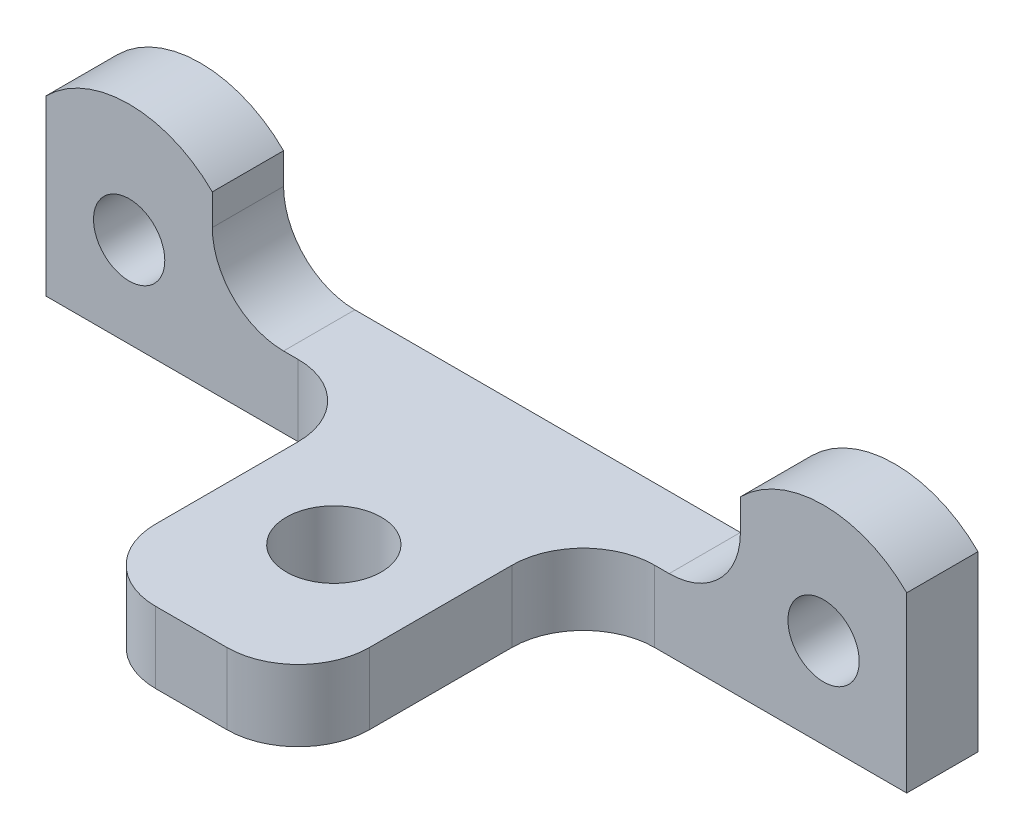
ISO-10303-21;
HEADER;
FILE_DESCRIPTION(('STEP AP214'),'2;1');
FILE_NAME('part.step','',(''),(''),'','','');
FILE_SCHEMA(('AUTOMOTIVE_DESIGN { 1 0 10303 214 1 1 1 1 }'));
ENDSEC;
DATA;
#1=APPLICATION_CONTEXT('core data for automotive mechanical design processes');
#2=APPLICATION_PROTOCOL_DEFINITION('international standard','automotive_design',2000,#1);
#3=PRODUCT_CONTEXT('',#1,'mechanical');
#4=PRODUCT('Part','Part','',(#3));
#5=PRODUCT_RELATED_PRODUCT_CATEGORY('part','',(#4));
#6=PRODUCT_DEFINITION_FORMATION('','',#4);
#7=PRODUCT_DEFINITION_CONTEXT('part definition',#1,'design');
#8=PRODUCT_DEFINITION('design','',#6,#7);
#9=PRODUCT_DEFINITION_SHAPE('','',#8);
#10=(LENGTH_UNIT() NAMED_UNIT(*) SI_UNIT(.MILLI.,.METRE.));
#11=(NAMED_UNIT(*) PLANE_ANGLE_UNIT() SI_UNIT($,.RADIAN.));
#12=(NAMED_UNIT(*) SI_UNIT($,.STERADIAN.) SOLID_ANGLE_UNIT());
#13=UNCERTAINTY_MEASURE_WITH_UNIT(LENGTH_MEASURE(1.E-05),#10,'distance_accuracy_value','');
#14=(GEOMETRIC_REPRESENTATION_CONTEXT(3) GLOBAL_UNCERTAINTY_ASSIGNED_CONTEXT((#13)) GLOBAL_UNIT_ASSIGNED_CONTEXT((#10,
#11,#12)) REPRESENTATION_CONTEXT('',''));
#15=CARTESIAN_POINT('',(0.,0.,0.));
#16=DIRECTION('',(0.,0.,1.));
#17=DIRECTION('',(1.,0.,0.));
#18=AXIS2_PLACEMENT_3D('',#15,#16,#17);
#19=CARTESIAN_POINT('',(-14.615,3.8,3.));
#20=DIRECTION('',(0.,0.,-1.));
#21=DIRECTION('',(-1.,0.,0.));
#22=AXIS2_PLACEMENT_3D('',#19,#20,#21);
#23=PLANE('',#22);
#24=CARTESIAN_POINT('',(-14.615,3.8,3.));
#25=DIRECTION('',(0.,0.,1.));
#26=DIRECTION('',(1.,0.,0.));
#27=AXIS2_PLACEMENT_3D('',#24,#25,#26);
#28=CIRCLE('',#27,1.5);
#29=CARTESIAN_POINT('',(-13.115,3.8,3.));
#30=VERTEX_POINT('',#29);
#31=EDGE_CURVE('E274',#30,#30,#28,.T.);
#32=ORIENTED_EDGE('',*,*,#31,.F.);
#33=EDGE_LOOP('',(#32));
#34=FACE_BOUND('',#33,.T.);
#35=DIRECTION('',(1.,0.,0.));
#36=VECTOR('',#35,1.);
#37=CARTESIAN_POINT('',(-18.115,0.,3.));
#38=LINE('',#37,#36);
#39=CARTESIAN_POINT('',(-18.115,0.,3.));
#40=VERTEX_POINT('',#39);
#41=CARTESIAN_POINT('',(-7.5,0.,3.));
#42=VERTEX_POINT('',#41);
#43=EDGE_CURVE('E317',#40,#42,#38,.T.);
#44=ORIENTED_EDGE('',*,*,#43,.T.);
#45=DIRECTION('',(0.,-1.,0.));
#46=VECTOR('',#45,1.);
#47=CARTESIAN_POINT('',(-7.5,3.,3.));
#48=LINE('',#47,#46);
#49=CARTESIAN_POINT('',(-7.5,3.,3.));
#50=VERTEX_POINT('',#49);
#51=EDGE_CURVE('E220',#42,#50,#48,.F.);
#52=ORIENTED_EDGE('',*,*,#51,.T.);
#53=DIRECTION('',(-1.,0.,0.));
#54=VECTOR('',#53,1.);
#55=CARTESIAN_POINT('',(-11.115,3.,3.));
#56=LINE('',#55,#54);
#57=CARTESIAN_POINT('',(-8.115,3.,3.));
#58=VERTEX_POINT('',#57);
#59=EDGE_CURVE('E263',#50,#58,#56,.T.);
#60=ORIENTED_EDGE('',*,*,#59,.T.);
#61=CARTESIAN_POINT('',(-8.115,6.,3.));
#62=DIRECTION('',(0.,0.,-1.));
#63=DIRECTION('',(-1.,0.,0.));
#64=AXIS2_PLACEMENT_3D('',#61,#62,#63);
#65=CIRCLE('',#64,3.);
#66=CARTESIAN_POINT('',(-11.115,6.,3.));
#67=VERTEX_POINT('',#66);
#68=EDGE_CURVE('E228',#58,#67,#65,.T.);
#69=ORIENTED_EDGE('',*,*,#68,.T.);
#70=DIRECTION('',(0.,1.,0.));
#71=VECTOR('',#70,1.);
#72=CARTESIAN_POINT('',(-11.115,7.3,3.));
#73=LINE('',#72,#71);
#74=CARTESIAN_POINT('',(-11.115,7.3,3.));
#75=VERTEX_POINT('',#74);
#76=EDGE_CURVE('E171',#67,#75,#73,.T.);
#77=ORIENTED_EDGE('',*,*,#76,.T.);
#78=CARTESIAN_POINT('',(-14.615,3.8,3.));
#79=DIRECTION('',(0.,0.,1.));
#80=DIRECTION('',(-1.,0.,0.));
#81=AXIS2_PLACEMENT_3D('',#78,#79,#80);
#82=CIRCLE('',#81,4.94974746830583);
#83=CARTESIAN_POINT('',(-18.115,7.3,3.));
#84=VERTEX_POINT('',#83);
#85=EDGE_CURVE('E167',#75,#84,#82,.T.);
#86=ORIENTED_EDGE('',*,*,#85,.T.);
#87=DIRECTION('',(0.,-1.,0.));
#88=VECTOR('',#87,1.);
#89=CARTESIAN_POINT('',(-18.115,7.3,3.));
#90=LINE('',#89,#88);
#91=EDGE_CURVE('E157',#84,#40,#90,.T.);
#92=ORIENTED_EDGE('',*,*,#91,.T.);
#93=EDGE_LOOP('',(#44,#52,#60,#69,#77,#86,#92));
#94=FACE_BOUND('',#93,.T.);
#95=ADVANCED_FACE('F33',(#34,#94),#23,.F.);
#96=CARTESIAN_POINT('',(14.615,3.80000000000001,3.));
#97=DIRECTION('',(0.,0.,1.));
#98=DIRECTION('',(1.,0.,0.));
#99=AXIS2_PLACEMENT_3D('',#96,#97,#98);
#100=CIRCLE('',#99,1.5);
#101=CARTESIAN_POINT('',(16.115,3.80000000000001,3.));
#102=VERTEX_POINT('',#101);
#103=EDGE_CURVE('E324',#102,#102,#100,.T.);
#104=ORIENTED_EDGE('',*,*,#103,.F.);
#105=EDGE_LOOP('',(#104));
#106=FACE_BOUND('',#105,.T.);
#107=CARTESIAN_POINT('',(8.115,3.,3.));
#108=VERTEX_POINT('',#107);
#109=CARTESIAN_POINT('',(7.5,3.,3.));
#110=VERTEX_POINT('',#109);
#111=EDGE_CURVE('E257',#108,#110,#56,.T.);
#112=ORIENTED_EDGE('',*,*,#111,.T.);
#113=DIRECTION('',(0.,1.,0.));
#114=VECTOR('',#113,1.);
#115=CARTESIAN_POINT('',(7.5,0.,3.));
#116=LINE('',#115,#114);
#117=CARTESIAN_POINT('',(7.5,0.,3.));
#118=VERTEX_POINT('',#117);
#119=EDGE_CURVE('E204',#110,#118,#116,.F.);
#120=ORIENTED_EDGE('',*,*,#119,.T.);
#121=CARTESIAN_POINT('',(18.115,0.,3.));
#122=VERTEX_POINT('',#121);
#123=EDGE_CURVE('E166',#118,#122,#38,.T.);
#124=ORIENTED_EDGE('',*,*,#123,.T.);
#125=DIRECTION('',(0.,1.,0.));
#126=VECTOR('',#125,1.);
#127=CARTESIAN_POINT('',(18.115,0.,3.));
#128=LINE('',#127,#126);
#129=CARTESIAN_POINT('',(18.115,7.30000000000001,3.));
#130=VERTEX_POINT('',#129);
#131=EDGE_CURVE('E301',#122,#130,#128,.T.);
#132=ORIENTED_EDGE('',*,*,#131,.T.);
#133=CARTESIAN_POINT('',(14.615,3.80000000000001,3.));
#134=DIRECTION('',(0.,0.,1.));
#135=DIRECTION('',(-1.,0.,0.));
#136=AXIS2_PLACEMENT_3D('',#133,#134,#135);
#137=CIRCLE('',#136,4.94974746830583);
#138=CARTESIAN_POINT('',(11.115,7.3,3.));
#139=VERTEX_POINT('',#138);
#140=EDGE_CURVE('E316',#130,#139,#137,.T.);
#141=ORIENTED_EDGE('',*,*,#140,.T.);
#142=DIRECTION('',(0.,-1.,0.));
#143=VECTOR('',#142,1.);
#144=CARTESIAN_POINT('',(11.115,3.,3.));
#145=LINE('',#144,#143);
#146=CARTESIAN_POINT('',(11.115,6.,3.));
#147=VERTEX_POINT('',#146);
#148=EDGE_CURVE('E268',#139,#147,#145,.T.);
#149=ORIENTED_EDGE('',*,*,#148,.T.);
#150=CARTESIAN_POINT('',(8.115,6.,3.));
#151=DIRECTION('',(0.,0.,-1.));
#152=DIRECTION('',(-1.,0.,0.));
#153=AXIS2_PLACEMENT_3D('',#150,#151,#152);
#154=CIRCLE('',#153,3.);
#155=EDGE_CURVE('E224',#147,#108,#154,.T.);
#156=ORIENTED_EDGE('',*,*,#155,.T.);
#157=EDGE_LOOP('',(#112,#120,#124,#132,#141,#149,#156));
#158=FACE_BOUND('',#157,.T.);
#159=ADVANCED_FACE('F260',(#106,#158),#23,.F.);
#160=CARTESIAN_POINT('',(-14.615,3.8,0.));
#161=DIRECTION('',(0.,0.,-1.));
#162=DIRECTION('',(-1.,0.,0.));
#163=AXIS2_PLACEMENT_3D('',#160,#161,#162);
#164=PLANE('',#163);
#165=CARTESIAN_POINT('',(-14.615,3.8,0.));
#166=DIRECTION('',(0.,0.,1.));
#167=DIRECTION('',(1.,0.,0.));
#168=AXIS2_PLACEMENT_3D('',#165,#166,#167);
#169=CIRCLE('',#168,1.5);
#170=CARTESIAN_POINT('',(-13.115,3.8,0.));
#171=VERTEX_POINT('',#170);
#172=EDGE_CURVE('E321',#171,#171,#169,.T.);
#173=ORIENTED_EDGE('',*,*,#172,.T.);
#174=EDGE_LOOP('',(#173));
#175=FACE_BOUND('',#174,.T.);
#176=CARTESIAN_POINT('',(-14.615,3.8,0.));
#177=DIRECTION('',(0.,0.,1.));
#178=DIRECTION('',(-1.,0.,0.));
#179=AXIS2_PLACEMENT_3D('',#176,#177,#178);
#180=CIRCLE('',#179,4.94974746830583);
#181=CARTESIAN_POINT('',(-11.115,7.3,0.));
#182=VERTEX_POINT('',#181);
#183=CARTESIAN_POINT('',(-18.115,7.3,0.));
#184=VERTEX_POINT('',#183);
#185=EDGE_CURVE('E179',#182,#184,#180,.T.);
#186=ORIENTED_EDGE('',*,*,#185,.F.);
#187=DIRECTION('',(0.,1.,0.));
#188=VECTOR('',#187,1.);
#189=CARTESIAN_POINT('',(-11.115,7.3,0.));
#190=LINE('',#189,#188);
#191=CARTESIAN_POINT('',(-11.115,6.,0.));
#192=VERTEX_POINT('',#191);
#193=EDGE_CURVE('E175',#192,#182,#190,.T.);
#194=ORIENTED_EDGE('',*,*,#193,.F.);
#195=CARTESIAN_POINT('',(-8.115,6.,0.));
#196=DIRECTION('',(0.,0.,-1.));
#197=DIRECTION('',(-1.,0.,0.));
#198=AXIS2_PLACEMENT_3D('',#195,#196,#197);
#199=CIRCLE('',#198,3.);
#200=CARTESIAN_POINT('',(-8.115,3.,0.));
#201=VERTEX_POINT('',#200);
#202=EDGE_CURVE('E226',#192,#201,#199,.F.);
#203=ORIENTED_EDGE('',*,*,#202,.T.);
#204=DIRECTION('',(-1.,0.,0.));
#205=VECTOR('',#204,1.);
#206=CARTESIAN_POINT('',(-11.115,3.,0.));
#207=LINE('',#206,#205);
#208=CARTESIAN_POINT('',(8.115,3.,0.));
#209=VERTEX_POINT('',#208);
#210=EDGE_CURVE('E285',#209,#201,#207,.T.);
#211=ORIENTED_EDGE('',*,*,#210,.F.);
#212=CARTESIAN_POINT('',(8.115,6.,0.));
#213=DIRECTION('',(0.,0.,-1.));
#214=DIRECTION('',(-1.,0.,0.));
#215=AXIS2_PLACEMENT_3D('',#212,#213,#214);
#216=CIRCLE('',#215,3.);
#217=CARTESIAN_POINT('',(11.115,6.,0.));
#218=VERTEX_POINT('',#217);
#219=EDGE_CURVE('E222',#209,#218,#216,.F.);
#220=ORIENTED_EDGE('',*,*,#219,.T.);
#221=DIRECTION('',(0.,-1.,0.));
#222=VECTOR('',#221,1.);
#223=CARTESIAN_POINT('',(11.115,3.,0.));
#224=LINE('',#223,#222);
#225=CARTESIAN_POINT('',(11.115,7.3,0.));
#226=VERTEX_POINT('',#225);
#227=EDGE_CURVE('E282',#226,#218,#224,.T.);
#228=ORIENTED_EDGE('',*,*,#227,.F.);
#229=CARTESIAN_POINT('',(14.615,3.80000000000001,0.));
#230=DIRECTION('',(0.,0.,1.));
#231=DIRECTION('',(-1.,0.,0.));
#232=AXIS2_PLACEMENT_3D('',#229,#230,#231);
#233=CIRCLE('',#232,4.94974746830583);
#234=CARTESIAN_POINT('',(18.115,7.30000000000001,0.));
#235=VERTEX_POINT('',#234);
#236=EDGE_CURVE('E280',#235,#226,#233,.T.);
#237=ORIENTED_EDGE('',*,*,#236,.F.);
#238=DIRECTION('',(0.,1.,0.));
#239=VECTOR('',#238,1.);
#240=CARTESIAN_POINT('',(18.115,0.,0.));
#241=LINE('',#240,#239);
#242=CARTESIAN_POINT('',(18.115,0.,0.));
#243=VERTEX_POINT('',#242);
#244=EDGE_CURVE('E278',#243,#235,#241,.T.);
#245=ORIENTED_EDGE('',*,*,#244,.F.);
#246=DIRECTION('',(1.,0.,0.));
#247=VECTOR('',#246,1.);
#248=CARTESIAN_POINT('',(-18.115,0.,0.));
#249=LINE('',#248,#247);
#250=CARTESIAN_POINT('',(-18.115,0.,0.));
#251=VERTEX_POINT('',#250);
#252=EDGE_CURVE('E276',#251,#243,#249,.T.);
#253=ORIENTED_EDGE('',*,*,#252,.F.);
#254=DIRECTION('',(0.,-1.,0.));
#255=VECTOR('',#254,1.);
#256=CARTESIAN_POINT('',(-18.115,7.3,0.));
#257=LINE('',#256,#255);
#258=EDGE_CURVE('E273',#184,#251,#257,.T.);
#259=ORIENTED_EDGE('',*,*,#258,.F.);
#260=EDGE_LOOP('',(#186,#194,#203,#211,#220,#228,#237,#245,#253,#259));
#261=FACE_BOUND('',#260,.T.);
#262=CARTESIAN_POINT('',(14.615,3.80000000000001,0.));
#263=DIRECTION('',(0.,0.,1.));
#264=DIRECTION('',(1.,0.,0.));
#265=AXIS2_PLACEMENT_3D('',#262,#263,#264);
#266=CIRCLE('',#265,1.5);
#267=CARTESIAN_POINT('',(16.115,3.80000000000001,0.));
#268=VERTEX_POINT('',#267);
#269=EDGE_CURVE('E327',#268,#268,#266,.T.);
#270=ORIENTED_EDGE('',*,*,#269,.T.);
#271=EDGE_LOOP('',(#270));
#272=FACE_BOUND('',#271,.T.);
#273=ADVANCED_FACE('F305',(#175,#261,#272),#164,.T.);
#274=CARTESIAN_POINT('',(-14.615,3.8,3.));
#275=DIRECTION('',(0.,0.,-1.));
#276=DIRECTION('',(-1.,0.,0.));
#277=AXIS2_PLACEMENT_3D('',#274,#275,#276);
#278=CYLINDRICAL_SURFACE('',#277,4.94974746830583);
#279=ORIENTED_EDGE('',*,*,#185,.T.);
#280=DIRECTION('',(0.,0.,-1.));
#281=VECTOR('',#280,1.);
#282=CARTESIAN_POINT('',(-18.115,7.3,3.));
#283=LINE('',#282,#281);
#284=EDGE_CURVE('E161',#84,#184,#283,.T.);
#285=ORIENTED_EDGE('',*,*,#284,.F.);
#286=ORIENTED_EDGE('',*,*,#85,.F.);
#287=DIRECTION('',(0.,0.,-1.));
#288=VECTOR('',#287,1.);
#289=CARTESIAN_POINT('',(-11.115,7.3,3.));
#290=LINE('',#289,#288);
#291=EDGE_CURVE('E265',#75,#182,#290,.T.);
#292=ORIENTED_EDGE('',*,*,#291,.T.);
#293=EDGE_LOOP('',(#279,#285,#286,#292));
#294=FACE_BOUND('',#293,.T.);
#295=ADVANCED_FACE('F177',(#294),#278,.T.);
#296=CARTESIAN_POINT('',(-18.115,7.3,3.));
#297=DIRECTION('',(1.,0.,0.));
#298=DIRECTION('',(0.,0.,-1.));
#299=AXIS2_PLACEMENT_3D('',#296,#297,#298);
#300=PLANE('',#299);
#301=ORIENTED_EDGE('',*,*,#258,.T.);
#302=DIRECTION('',(0.,0.,-1.));
#303=VECTOR('',#302,1.);
#304=CARTESIAN_POINT('',(-18.115,0.,3.));
#305=LINE('',#304,#303);
#306=EDGE_CURVE('E164',#40,#251,#305,.T.);
#307=ORIENTED_EDGE('',*,*,#306,.F.);
#308=ORIENTED_EDGE('',*,*,#91,.F.);
#309=ORIENTED_EDGE('',*,*,#284,.T.);
#310=EDGE_LOOP('',(#301,#307,#308,#309));
#311=FACE_BOUND('',#310,.T.);
#312=ADVANCED_FACE('F159',(#311),#300,.F.);
#313=CARTESIAN_POINT('',(-18.115,0.,3.));
#314=DIRECTION('',(0.,1.,0.));
#315=DIRECTION('',(0.,0.,1.));
#316=AXIS2_PLACEMENT_3D('',#313,#314,#315);
#317=PLANE('',#316);
#318=CARTESIAN_POINT('',(0.,0.,9.));
#319=DIRECTION('',(0.,1.,0.));
#320=DIRECTION('',(0.,0.,1.));
#321=AXIS2_PLACEMENT_3D('',#318,#319,#320);
#322=CIRCLE('',#321,2.);
#323=CARTESIAN_POINT('',(0.,0.,11.));
#324=VERTEX_POINT('',#323);
#325=EDGE_CURVE('E343',#324,#324,#322,.T.);
#326=ORIENTED_EDGE('',*,*,#325,.T.);
#327=EDGE_LOOP('',(#326));
#328=FACE_BOUND('',#327,.T.);
#329=DIRECTION('',(0.,0.,-1.));
#330=VECTOR('',#329,1.);
#331=CARTESIAN_POINT('',(4.5,0.,15.));
#332=LINE('',#331,#330);
#333=CARTESIAN_POINT('',(4.5,0.,12.));
#334=VERTEX_POINT('',#333);
#335=CARTESIAN_POINT('',(4.5,0.,6.));
#336=VERTEX_POINT('',#335);
#337=EDGE_CURVE('E238',#334,#336,#332,.T.);
#338=ORIENTED_EDGE('',*,*,#337,.F.);
#339=CARTESIAN_POINT('',(1.5,0.,12.));
#340=DIRECTION('',(0.,1.,0.));
#341=DIRECTION('',(0.,0.,1.));
#342=AXIS2_PLACEMENT_3D('',#339,#340,#341);
#343=CIRCLE('',#342,3.);
#344=CARTESIAN_POINT('',(1.5,0.,15.));
#345=VERTEX_POINT('',#344);
#346=EDGE_CURVE('E214',#334,#345,#343,.F.);
#347=ORIENTED_EDGE('',*,*,#346,.T.);
#348=DIRECTION('',(1.,0.,0.));
#349=VECTOR('',#348,1.);
#350=CARTESIAN_POINT('',(-4.5,0.,15.));
#351=LINE('',#350,#349);
#352=CARTESIAN_POINT('',(-1.5,0.,15.));
#353=VERTEX_POINT('',#352);
#354=EDGE_CURVE('E340',#353,#345,#351,.T.);
#355=ORIENTED_EDGE('',*,*,#354,.F.);
#356=CARTESIAN_POINT('',(-1.5,0.,12.));
#357=DIRECTION('',(0.,1.,0.));
#358=DIRECTION('',(0.,0.,1.));
#359=AXIS2_PLACEMENT_3D('',#356,#357,#358);
#360=CIRCLE('',#359,3.);
#361=CARTESIAN_POINT('',(-4.5,0.,12.));
#362=VERTEX_POINT('',#361);
#363=EDGE_CURVE('E212',#353,#362,#360,.F.);
#364=ORIENTED_EDGE('',*,*,#363,.T.);
#365=DIRECTION('',(0.,0.,-1.));
#366=VECTOR('',#365,1.);
#367=CARTESIAN_POINT('',(-4.5,0.,15.));
#368=LINE('',#367,#366);
#369=CARTESIAN_POINT('',(-4.5,0.,6.));
#370=VERTEX_POINT('',#369);
#371=EDGE_CURVE('E249',#362,#370,#368,.T.);
#372=ORIENTED_EDGE('',*,*,#371,.T.);
#373=CARTESIAN_POINT('',(-7.5,0.,6.));
#374=DIRECTION('',(0.,1.,0.));
#375=DIRECTION('',(0.,0.,1.));
#376=AXIS2_PLACEMENT_3D('',#373,#374,#375);
#377=CIRCLE('',#376,3.);
#378=EDGE_CURVE('E41',#370,#42,#377,.T.);
#379=ORIENTED_EDGE('',*,*,#378,.T.);
#380=ORIENTED_EDGE('',*,*,#43,.F.);
#381=ORIENTED_EDGE('',*,*,#306,.T.);
#382=ORIENTED_EDGE('',*,*,#252,.T.);
#383=DIRECTION('',(0.,0.,-1.));
#384=VECTOR('',#383,1.);
#385=CARTESIAN_POINT('',(18.115,0.,3.));
#386=LINE('',#385,#384);
#387=EDGE_CURVE('E184',#122,#243,#386,.T.);
#388=ORIENTED_EDGE('',*,*,#387,.F.);
#389=ORIENTED_EDGE('',*,*,#123,.F.);
#390=CARTESIAN_POINT('',(7.5,0.,6.));
#391=DIRECTION('',(0.,1.,0.));
#392=DIRECTION('',(0.,0.,1.));
#393=AXIS2_PLACEMENT_3D('',#390,#391,#392);
#394=CIRCLE('',#393,3.);
#395=EDGE_CURVE('E232',#118,#336,#394,.T.);
#396=ORIENTED_EDGE('',*,*,#395,.T.);
#397=EDGE_LOOP('',(#338,#347,#355,#364,#372,#379,#380,#381,#382,#388,#389,#396));
#398=FACE_BOUND('',#397,.T.);
#399=ADVANCED_FACE('F237',(#328,#398),#317,.F.);
#400=CARTESIAN_POINT('',(18.115,0.,3.));
#401=DIRECTION('',(-1.,0.,0.));
#402=DIRECTION('',(0.,-1.,0.));
#403=AXIS2_PLACEMENT_3D('',#400,#401,#402);
#404=PLANE('',#403);
#405=ORIENTED_EDGE('',*,*,#244,.T.);
#406=DIRECTION('',(0.,0.,-1.));
#407=VECTOR('',#406,1.);
#408=CARTESIAN_POINT('',(18.115,7.30000000000001,3.));
#409=LINE('',#408,#407);
#410=EDGE_CURVE('E293',#130,#235,#409,.T.);
#411=ORIENTED_EDGE('',*,*,#410,.F.);
#412=ORIENTED_EDGE('',*,*,#131,.F.);
#413=ORIENTED_EDGE('',*,*,#387,.T.);
#414=EDGE_LOOP('',(#405,#411,#412,#413));
#415=FACE_BOUND('',#414,.T.);
#416=ADVANCED_FACE('F299',(#415),#404,.F.);
#417=CARTESIAN_POINT('',(14.615,3.80000000000001,3.));
#418=DIRECTION('',(0.,0.,-1.));
#419=DIRECTION('',(-1.,0.,0.));
#420=AXIS2_PLACEMENT_3D('',#417,#418,#419);
#421=CYLINDRICAL_SURFACE('',#420,4.94974746830583);
#422=ORIENTED_EDGE('',*,*,#236,.T.);
#423=DIRECTION('',(0.,0.,-1.));
#424=VECTOR('',#423,1.);
#425=CARTESIAN_POINT('',(11.115,7.3,3.));
#426=LINE('',#425,#424);
#427=EDGE_CURVE('E290',#139,#226,#426,.T.);
#428=ORIENTED_EDGE('',*,*,#427,.F.);
#429=ORIENTED_EDGE('',*,*,#140,.F.);
#430=ORIENTED_EDGE('',*,*,#410,.T.);
#431=EDGE_LOOP('',(#422,#428,#429,#430));
#432=FACE_BOUND('',#431,.T.);
#433=ADVANCED_FACE('F310',(#432),#421,.T.);
#434=CARTESIAN_POINT('',(11.115,3.,3.));
#435=DIRECTION('',(1.,0.,0.));
#436=DIRECTION('',(0.,1.,0.));
#437=AXIS2_PLACEMENT_3D('',#434,#435,#436);
#438=PLANE('',#437);
#439=ORIENTED_EDGE('',*,*,#227,.T.);
#440=DIRECTION('',(0.,0.,-1.));
#441=VECTOR('',#440,1.);
#442=CARTESIAN_POINT('',(11.115,6.,3.));
#443=LINE('',#442,#441);
#444=EDGE_CURVE('E194',#218,#147,#443,.F.);
#445=ORIENTED_EDGE('',*,*,#444,.T.);
#446=ORIENTED_EDGE('',*,*,#148,.F.);
#447=ORIENTED_EDGE('',*,*,#427,.T.);
#448=EDGE_LOOP('',(#439,#445,#446,#447));
#449=FACE_BOUND('',#448,.T.);
#450=ADVANCED_FACE('F314',(#449),#438,.F.);
#451=CARTESIAN_POINT('',(-11.115,3.,3.));
#452=DIRECTION('',(0.,-1.,0.));
#453=DIRECTION('',(0.,0.,-1.));
#454=AXIS2_PLACEMENT_3D('',#451,#452,#453);
#455=PLANE('',#454);
#456=CARTESIAN_POINT('',(0.,3.,9.));
#457=DIRECTION('',(0.,1.,0.));
#458=DIRECTION('',(0.,0.,1.));
#459=AXIS2_PLACEMENT_3D('',#456,#457,#458);
#460=CIRCLE('',#459,2.);
#461=CARTESIAN_POINT('',(0.,3.,11.));
#462=VERTEX_POINT('',#461);
#463=EDGE_CURVE('E344',#462,#462,#460,.T.);
#464=ORIENTED_EDGE('',*,*,#463,.F.);
#465=EDGE_LOOP('',(#464));
#466=FACE_BOUND('',#465,.T.);
#467=ORIENTED_EDGE('',*,*,#111,.F.);
#468=DIRECTION('',(0.,0.,-1.));
#469=VECTOR('',#468,1.);
#470=CARTESIAN_POINT('',(8.115,3.,0.));
#471=LINE('',#470,#469);
#472=EDGE_CURVE('E191',#108,#209,#471,.T.);
#473=ORIENTED_EDGE('',*,*,#472,.T.);
#474=ORIENTED_EDGE('',*,*,#210,.T.);
#475=DIRECTION('',(0.,0.,-1.));
#476=VECTOR('',#475,1.);
#477=CARTESIAN_POINT('',(-8.115,3.,3.));
#478=LINE('',#477,#476);
#479=EDGE_CURVE('E189',#201,#58,#478,.F.);
#480=ORIENTED_EDGE('',*,*,#479,.T.);
#481=ORIENTED_EDGE('',*,*,#59,.F.);
#482=CARTESIAN_POINT('',(-7.5,3.,6.));
#483=DIRECTION('',(0.,-1.,0.));
#484=DIRECTION('',(0.,0.,-1.));
#485=AXIS2_PLACEMENT_3D('',#482,#483,#484);
#486=CIRCLE('',#485,3.);
#487=CARTESIAN_POINT('',(-4.5,3.,6.));
#488=VERTEX_POINT('',#487);
#489=EDGE_CURVE('E11',#50,#488,#486,.T.);
#490=ORIENTED_EDGE('',*,*,#489,.T.);
#491=DIRECTION('',(0.,0.,-1.));
#492=VECTOR('',#491,1.);
#493=CARTESIAN_POINT('',(-4.5,3.,15.));
#494=LINE('',#493,#492);
#495=CARTESIAN_POINT('',(-4.5,3.,12.));
#496=VERTEX_POINT('',#495);
#497=EDGE_CURVE('E334',#496,#488,#494,.T.);
#498=ORIENTED_EDGE('',*,*,#497,.F.);
#499=CARTESIAN_POINT('',(-1.5,3.,12.));
#500=DIRECTION('',(0.,-1.,0.));
#501=DIRECTION('',(0.,0.,-1.));
#502=AXIS2_PLACEMENT_3D('',#499,#500,#501);
#503=CIRCLE('',#502,3.);
#504=CARTESIAN_POINT('',(-1.5,3.,15.));
#505=VERTEX_POINT('',#504);
#506=EDGE_CURVE('E180',#496,#505,#503,.F.);
#507=ORIENTED_EDGE('',*,*,#506,.T.);
#508=DIRECTION('',(-1.,0.,0.));
#509=VECTOR('',#508,1.);
#510=CARTESIAN_POINT('',(-4.5,3.,15.));
#511=LINE('',#510,#509);
#512=CARTESIAN_POINT('',(1.5,3.,15.));
#513=VERTEX_POINT('',#512);
#514=EDGE_CURVE('E337',#513,#505,#511,.T.);
#515=ORIENTED_EDGE('',*,*,#514,.F.);
#516=CARTESIAN_POINT('',(1.5,3.,12.));
#517=DIRECTION('',(0.,-1.,0.));
#518=DIRECTION('',(0.,0.,-1.));
#519=AXIS2_PLACEMENT_3D('',#516,#517,#518);
#520=CIRCLE('',#519,3.);
#521=CARTESIAN_POINT('',(4.5,3.,12.));
#522=VERTEX_POINT('',#521);
#523=EDGE_CURVE('E182',#513,#522,#520,.F.);
#524=ORIENTED_EDGE('',*,*,#523,.T.);
#525=DIRECTION('',(0.,0.,-1.));
#526=VECTOR('',#525,1.);
#527=CARTESIAN_POINT('',(4.5,3.,15.));
#528=LINE('',#527,#526);
#529=CARTESIAN_POINT('',(4.5,3.,6.));
#530=VERTEX_POINT('',#529);
#531=EDGE_CURVE('E250',#522,#530,#528,.T.);
#532=ORIENTED_EDGE('',*,*,#531,.T.);
#533=CARTESIAN_POINT('',(7.5,3.,6.));
#534=DIRECTION('',(0.,-1.,0.));
#535=DIRECTION('',(0.,0.,-1.));
#536=AXIS2_PLACEMENT_3D('',#533,#534,#535);
#537=CIRCLE('',#536,3.);
#538=EDGE_CURVE('E230',#530,#110,#537,.T.);
#539=ORIENTED_EDGE('',*,*,#538,.T.);
#540=EDGE_LOOP('',(#467,#473,#474,#480,#481,#490,#498,#507,#515,#524,#532,#539));
#541=FACE_BOUND('',#540,.T.);
#542=ADVANCED_FACE('F256',(#466,#541),#455,.F.);
#543=CARTESIAN_POINT('',(-11.115,7.3,3.));
#544=DIRECTION('',(-1.,0.,0.));
#545=DIRECTION('',(0.,-1.,0.));
#546=AXIS2_PLACEMENT_3D('',#543,#544,#545);
#547=PLANE('',#546);
#548=ORIENTED_EDGE('',*,*,#76,.F.);
#549=DIRECTION('',(0.,0.,-1.));
#550=VECTOR('',#549,1.);
#551=CARTESIAN_POINT('',(-11.115,6.,0.));
#552=LINE('',#551,#550);
#553=EDGE_CURVE('E196',#67,#192,#552,.T.);
#554=ORIENTED_EDGE('',*,*,#553,.T.);
#555=ORIENTED_EDGE('',*,*,#193,.T.);
#556=ORIENTED_EDGE('',*,*,#291,.F.);
#557=EDGE_LOOP('',(#548,#554,#555,#556));
#558=FACE_BOUND('',#557,.T.);
#559=ADVANCED_FACE('F360',(#558),#547,.F.);
#560=CARTESIAN_POINT('',(-14.615,3.8,3.));
#561=DIRECTION('',(0.,0.,-1.));
#562=DIRECTION('',(-1.,0.,0.));
#563=AXIS2_PLACEMENT_3D('',#560,#561,#562);
#564=CYLINDRICAL_SURFACE('',#563,1.5);
#565=ORIENTED_EDGE('',*,*,#31,.T.);
#566=EDGE_LOOP('',(#565));
#567=FACE_BOUND('',#566,.T.);
#568=ORIENTED_EDGE('',*,*,#172,.F.);
#569=EDGE_LOOP('',(#568));
#570=FACE_BOUND('',#569,.T.);
#571=ADVANCED_FACE('F366',(#567,#570),#564,.F.);
#572=CARTESIAN_POINT('',(14.615,3.80000000000001,3.));
#573=DIRECTION('',(0.,0.,-1.));
#574=DIRECTION('',(-1.,0.,0.));
#575=AXIS2_PLACEMENT_3D('',#572,#573,#574);
#576=CYLINDRICAL_SURFACE('',#575,1.5);
#577=ORIENTED_EDGE('',*,*,#103,.T.);
#578=EDGE_LOOP('',(#577));
#579=FACE_BOUND('',#578,.T.);
#580=ORIENTED_EDGE('',*,*,#269,.F.);
#581=EDGE_LOOP('',(#580));
#582=FACE_BOUND('',#581,.T.);
#583=ADVANCED_FACE('F390',(#579,#582),#576,.F.);
#584=CARTESIAN_POINT('',(-4.5,3.,15.));
#585=DIRECTION('',(1.,0.,0.));
#586=DIRECTION('',(0.,1.,0.));
#587=AXIS2_PLACEMENT_3D('',#584,#585,#586);
#588=PLANE('',#587);
#589=ORIENTED_EDGE('',*,*,#371,.F.);
#590=DIRECTION('',(0.,-1.,0.));
#591=VECTOR('',#590,1.);
#592=CARTESIAN_POINT('',(-4.5,3.,12.));
#593=LINE('',#592,#591);
#594=EDGE_CURVE('E218',#362,#496,#593,.F.);
#595=ORIENTED_EDGE('',*,*,#594,.T.);
#596=ORIENTED_EDGE('',*,*,#497,.T.);
#597=DIRECTION('',(0.,-1.,0.));
#598=VECTOR('',#597,1.);
#599=CARTESIAN_POINT('',(-4.5,0.,6.));
#600=LINE('',#599,#598);
#601=EDGE_CURVE('E216',#488,#370,#600,.T.);
#602=ORIENTED_EDGE('',*,*,#601,.T.);
#603=EDGE_LOOP('',(#589,#595,#596,#602));
#604=FACE_BOUND('',#603,.T.);
#605=ADVANCED_FACE('F395',(#604),#588,.F.);
#606=CARTESIAN_POINT('',(4.5,3.,15.));
#607=DIRECTION('',(-1.,0.,0.));
#608=DIRECTION('',(0.,-1.,0.));
#609=AXIS2_PLACEMENT_3D('',#606,#607,#608);
#610=PLANE('',#609);
#611=ORIENTED_EDGE('',*,*,#337,.T.);
#612=DIRECTION('',(0.,1.,0.));
#613=VECTOR('',#612,1.);
#614=CARTESIAN_POINT('',(4.5,3.,6.));
#615=LINE('',#614,#613);
#616=EDGE_CURVE('E201',#336,#530,#615,.T.);
#617=ORIENTED_EDGE('',*,*,#616,.T.);
#618=ORIENTED_EDGE('',*,*,#531,.F.);
#619=DIRECTION('',(0.,1.,0.));
#620=VECTOR('',#619,1.);
#621=CARTESIAN_POINT('',(4.5,0.,12.));
#622=LINE('',#621,#620);
#623=EDGE_CURVE('E199',#522,#334,#622,.F.);
#624=ORIENTED_EDGE('',*,*,#623,.T.);
#625=EDGE_LOOP('',(#611,#617,#618,#624));
#626=FACE_BOUND('',#625,.T.);
#627=ADVANCED_FACE('F245',(#626),#610,.F.);
#628=CARTESIAN_POINT('',(0.,0.,15.));
#629=DIRECTION('',(0.,0.,1.));
#630=DIRECTION('',(1.,0.,0.));
#631=AXIS2_PLACEMENT_3D('',#628,#629,#630);
#632=PLANE('',#631);
#633=ORIENTED_EDGE('',*,*,#354,.T.);
#634=DIRECTION('',(0.,1.,0.));
#635=VECTOR('',#634,1.);
#636=CARTESIAN_POINT('',(1.5,3.,15.));
#637=LINE('',#636,#635);
#638=EDGE_CURVE('E209',#345,#513,#637,.T.);
#639=ORIENTED_EDGE('',*,*,#638,.T.);
#640=ORIENTED_EDGE('',*,*,#514,.T.);
#641=DIRECTION('',(0.,-1.,0.));
#642=VECTOR('',#641,1.);
#643=CARTESIAN_POINT('',(-1.5,0.,15.));
#644=LINE('',#643,#642);
#645=EDGE_CURVE('E206',#505,#353,#644,.T.);
#646=ORIENTED_EDGE('',*,*,#645,.T.);
#647=EDGE_LOOP('',(#633,#639,#640,#646));
#648=FACE_BOUND('',#647,.T.);
#649=ADVANCED_FACE('F355',(#648),#632,.T.);
#650=CARTESIAN_POINT('',(0.,0.,9.));
#651=DIRECTION('',(0.,1.,0.));
#652=DIRECTION('',(0.,0.,1.));
#653=AXIS2_PLACEMENT_3D('',#650,#651,#652);
#654=CYLINDRICAL_SURFACE('',#653,2.);
#655=ORIENTED_EDGE('',*,*,#325,.F.);
#656=EDGE_LOOP('',(#655));
#657=FACE_BOUND('',#656,.T.);
#658=ORIENTED_EDGE('',*,*,#463,.T.);
#659=EDGE_LOOP('',(#658));
#660=FACE_BOUND('',#659,.T.);
#661=ADVANCED_FACE('F351',(#657,#660),#654,.F.);
#662=CARTESIAN_POINT('',(8.115,6.,3.));
#663=DIRECTION('',(0.,0.,1.));
#664=DIRECTION('',(1.,0.,0.));
#665=AXIS2_PLACEMENT_3D('',#662,#663,#664);
#666=CYLINDRICAL_SURFACE('',#665,3.);
#667=ORIENTED_EDGE('',*,*,#155,.F.);
#668=ORIENTED_EDGE('',*,*,#444,.F.);
#669=ORIENTED_EDGE('',*,*,#219,.F.);
#670=ORIENTED_EDGE('',*,*,#472,.F.);
#671=EDGE_LOOP('',(#667,#668,#669,#670));
#672=FACE_BOUND('',#671,.T.);
#673=ADVANCED_FACE('F354',(#672),#666,.F.);
#674=CARTESIAN_POINT('',(-8.115,6.,3.));
#675=DIRECTION('',(0.,0.,1.));
#676=DIRECTION('',(1.,0.,0.));
#677=AXIS2_PLACEMENT_3D('',#674,#675,#676);
#678=CYLINDRICAL_SURFACE('',#677,3.);
#679=ORIENTED_EDGE('',*,*,#68,.F.);
#680=ORIENTED_EDGE('',*,*,#479,.F.);
#681=ORIENTED_EDGE('',*,*,#202,.F.);
#682=ORIENTED_EDGE('',*,*,#553,.F.);
#683=EDGE_LOOP('',(#679,#680,#681,#682));
#684=FACE_BOUND('',#683,.T.);
#685=ADVANCED_FACE('F428',(#684),#678,.F.);
#686=CARTESIAN_POINT('',(7.5,3.,6.));
#687=DIRECTION('',(0.,-1.,0.));
#688=DIRECTION('',(1.,0.,0.));
#689=AXIS2_PLACEMENT_3D('',#686,#687,#688);
#690=CYLINDRICAL_SURFACE('',#689,3.);
#691=ORIENTED_EDGE('',*,*,#395,.F.);
#692=ORIENTED_EDGE('',*,*,#119,.F.);
#693=ORIENTED_EDGE('',*,*,#538,.F.);
#694=ORIENTED_EDGE('',*,*,#616,.F.);
#695=EDGE_LOOP('',(#691,#692,#693,#694));
#696=FACE_BOUND('',#695,.T.);
#697=ADVANCED_FACE('F252',(#696),#690,.F.);
#698=CARTESIAN_POINT('',(1.5,0.,12.));
#699=DIRECTION('',(0.,-1.,0.));
#700=DIRECTION('',(1.,0.,0.));
#701=AXIS2_PLACEMENT_3D('',#698,#699,#700);
#702=CYLINDRICAL_SURFACE('',#701,3.);
#703=ORIENTED_EDGE('',*,*,#346,.F.);
#704=ORIENTED_EDGE('',*,*,#623,.F.);
#705=ORIENTED_EDGE('',*,*,#523,.F.);
#706=ORIENTED_EDGE('',*,*,#638,.F.);
#707=EDGE_LOOP('',(#703,#704,#705,#706));
#708=FACE_BOUND('',#707,.T.);
#709=ADVANCED_FACE('F415',(#708),#702,.T.);
#710=CARTESIAN_POINT('',(-1.5,0.,12.));
#711=DIRECTION('',(0.,1.,0.));
#712=DIRECTION('',(-1.,0.,0.));
#713=AXIS2_PLACEMENT_3D('',#710,#711,#712);
#714=CYLINDRICAL_SURFACE('',#713,3.);
#715=ORIENTED_EDGE('',*,*,#506,.F.);
#716=ORIENTED_EDGE('',*,*,#594,.F.);
#717=ORIENTED_EDGE('',*,*,#363,.F.);
#718=ORIENTED_EDGE('',*,*,#645,.F.);
#719=EDGE_LOOP('',(#715,#716,#717,#718));
#720=FACE_BOUND('',#719,.T.);
#721=ADVANCED_FACE('F419',(#720),#714,.T.);
#722=CARTESIAN_POINT('',(-7.5,3.,6.));
#723=DIRECTION('',(0.,1.,0.));
#724=DIRECTION('',(-1.,0.,0.));
#725=AXIS2_PLACEMENT_3D('',#722,#723,#724);
#726=CYLINDRICAL_SURFACE('',#725,3.);
#727=ORIENTED_EDGE('',*,*,#489,.F.);
#728=ORIENTED_EDGE('',*,*,#51,.F.);
#729=ORIENTED_EDGE('',*,*,#378,.F.);
#730=ORIENTED_EDGE('',*,*,#601,.F.);
#731=EDGE_LOOP('',(#727,#728,#729,#730));
#732=FACE_BOUND('',#731,.T.);
#733=ADVANCED_FACE('F35',(#732),#726,.F.);
#734=CLOSED_SHELL('',(#95,#159,#273,#295,#312,#399,#416,#433,#450,#542,#559,#571,#583,#605,#627,
#649,#661,#673,#685,#697,#709,#721,#733));
#735=MANIFOLD_SOLID_BREP('B2',#734);
#736=ADVANCED_BREP_SHAPE_REPRESENTATION('',(#18,#735),#14);
#737=SHAPE_DEFINITION_REPRESENTATION(#9,#736);
ENDSEC;
END-ISO-10303-21;
